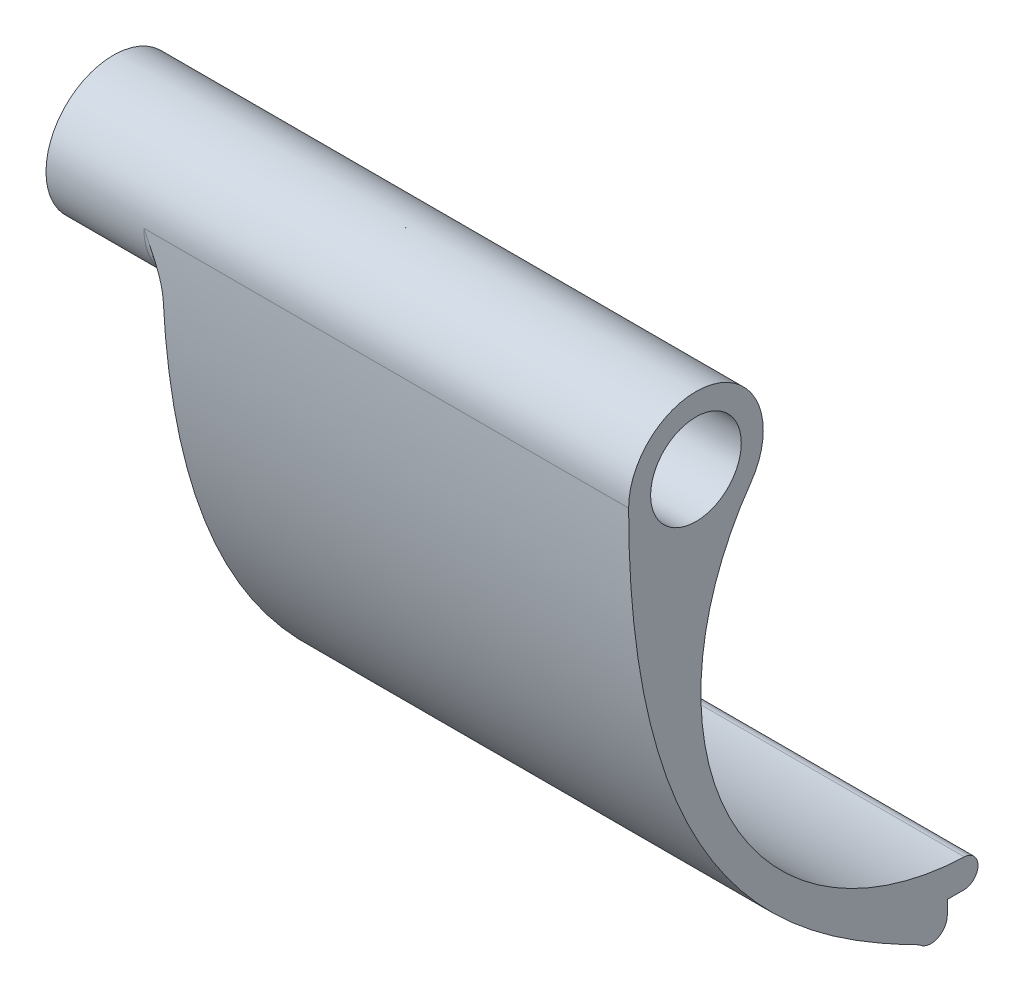
ISO-10303-21;
HEADER;
FILE_DESCRIPTION(('STEP AP214'),'2;1');
FILE_NAME('part.step','',(''),(''),'','','');
FILE_SCHEMA(('AUTOMOTIVE_DESIGN { 1 0 10303 214 1 1 1 1 }'));
ENDSEC;
DATA;
#1=APPLICATION_CONTEXT('core data for automotive mechanical design processes');
#2=APPLICATION_PROTOCOL_DEFINITION('international standard','automotive_design',2000,#1);
#3=PRODUCT_CONTEXT('',#1,'mechanical');
#4=PRODUCT('Part','Part','',(#3));
#5=PRODUCT_RELATED_PRODUCT_CATEGORY('part','',(#4));
#6=PRODUCT_DEFINITION_FORMATION('','',#4);
#7=PRODUCT_DEFINITION_CONTEXT('part definition',#1,'design');
#8=PRODUCT_DEFINITION('design','',#6,#7);
#9=PRODUCT_DEFINITION_SHAPE('','',#8);
#10=(LENGTH_UNIT() NAMED_UNIT(*) SI_UNIT(.MILLI.,.METRE.));
#11=(NAMED_UNIT(*) PLANE_ANGLE_UNIT() SI_UNIT($,.RADIAN.));
#12=(NAMED_UNIT(*) SI_UNIT($,.STERADIAN.) SOLID_ANGLE_UNIT());
#13=UNCERTAINTY_MEASURE_WITH_UNIT(LENGTH_MEASURE(1.E-05),#10,'distance_accuracy_value','');
#14=(GEOMETRIC_REPRESENTATION_CONTEXT(3) GLOBAL_UNCERTAINTY_ASSIGNED_CONTEXT((#13)) GLOBAL_UNIT_ASSIGNED_CONTEXT((#10,
#11,#12)) REPRESENTATION_CONTEXT('',''));
#15=CARTESIAN_POINT('',(0.,0.,0.));
#16=DIRECTION('',(0.,0.,1.));
#17=DIRECTION('',(1.,0.,0.));
#18=AXIS2_PLACEMENT_3D('',#15,#16,#17);
#19=CARTESIAN_POINT('',(66.04,-52.2496729145659,-4.41520027118186));
#20=DIRECTION('',(-1.,0.,0.));
#21=DIRECTION('',(0.,0.,1.));
#22=AXIS2_PLACEMENT_3D('',#19,#20,#21);
#23=PLANE('',#22);
#24=CARTESIAN_POINT('',(66.04,0.,9.525));
#25=CARTESIAN_POINT('',(66.04,-49.5650692046343,9.52500000000007));
#26=CARTESIAN_POINT('',(66.04,-65.0783953227281,-13.9379384526841));
#27=CARTESIAN_POINT('',(66.04,-74.0669897344399,-31.6077868114028));
#28=B_SPLINE_CURVE_WITH_KNOTS('',3,(#24,#25,#26,#27),.UNSPECIFIED.,.F.,.F.,(4,4),(0.,
0.946238125414386),.UNSPECIFIED.);
#29=CARTESIAN_POINT('',(66.04,0.,9.525));
#30=VERTEX_POINT('',#29);
#31=CARTESIAN_POINT('',(66.04,-74.0669897344399,-31.6077868114029));
#32=VERTEX_POINT('',#31);
#33=EDGE_CURVE('E113',#30,#32,#28,.T.);
#34=ORIENTED_EDGE('',*,*,#33,.T.);
#35=CARTESIAN_POINT('',(66.04,-72.4361186255965,-33.247405917965));
#36=DIRECTION('',(1.,0.,0.));
#37=DIRECTION('',(0.,0.,-1.));
#38=AXIS2_PLACEMENT_3D('',#35,#36,#37);
#39=CIRCLE('',#38,2.31259408203504);
#40=CARTESIAN_POINT('',(66.04,-72.4361186255965,-35.56));
#41=VERTEX_POINT('',#40);
#42=EDGE_CURVE('E103',#32,#41,#39,.T.);
#43=ORIENTED_EDGE('',*,*,#42,.T.);
#44=DIRECTION('',(0.,1.,0.));
#45=VECTOR('',#44,1.);
#46=CARTESIAN_POINT('',(66.04,-70.4890000000009,-35.56));
#47=LINE('',#46,#45);
#48=CARTESIAN_POINT('',(66.04,-70.4890000000009,-35.56));
#49=VERTEX_POINT('',#48);
#50=EDGE_CURVE('E112',#41,#49,#47,.T.);
#51=ORIENTED_EDGE('',*,*,#50,.T.);
#52=DIRECTION('',(0.,0.,-1.));
#53=VECTOR('',#52,1.);
#54=CARTESIAN_POINT('',(66.04,-70.4890000000009,-37.8977944152424));
#55=LINE('',#54,#53);
#56=CARTESIAN_POINT('',(66.04,-70.4890000000009,-37.8977944152424));
#57=VERTEX_POINT('',#56);
#58=EDGE_CURVE('E165',#49,#57,#55,.T.);
#59=ORIENTED_EDGE('',*,*,#58,.T.);
#60=CARTESIAN_POINT('',(66.04,-68.4811487911356,-37.8977944152424));
#61=DIRECTION('',(1.,0.,0.));
#62=DIRECTION('',(0.,0.,1.));
#63=AXIS2_PLACEMENT_3D('',#60,#61,#62);
#64=CIRCLE('',#63,2.00785120886528);
#65=CARTESIAN_POINT('',(66.04,-66.474655704137,-37.9716318635245));
#66=VERTEX_POINT('',#65);
#67=EDGE_CURVE('E167',#57,#66,#64,.T.);
#68=ORIENTED_EDGE('',*,*,#67,.T.);
#69=CARTESIAN_POINT('',(66.04,-27.8062883190183,-39.3945989275299));
#70=DIRECTION('',(-1.,0.,0.));
#71=DIRECTION('',(0.,0.,-1.));
#72=AXIS2_PLACEMENT_3D('',#69,#70,#71);
#73=CIRCLE('',#72,38.6945405903179);
#74=CARTESIAN_POINT('',(66.04,-5.49268808860924,-7.78177374132981));
#75=VERTEX_POINT('',#74);
#76=EDGE_CURVE('E169',#66,#75,#73,.T.);
#77=ORIENTED_EDGE('',*,*,#76,.T.);
#78=CARTESIAN_POINT('',(66.04,0.,0.));
#79=DIRECTION('',(1.,0.,0.));
#80=DIRECTION('',(0.,0.,1.));
#81=AXIS2_PLACEMENT_3D('',#78,#79,#80);
#82=CIRCLE('',#81,9.525);
#83=EDGE_CURVE('E118',#75,#30,#82,.T.);
#84=ORIENTED_EDGE('',*,*,#83,.T.);
#85=EDGE_LOOP('',(#34,#43,#51,#59,#68,#77,#84));
#86=FACE_BOUND('',#85,.T.);
#87=CARTESIAN_POINT('',(66.04,0.,0.));
#88=DIRECTION('',(1.,0.,0.));
#89=DIRECTION('',(0.,0.,-1.));
#90=AXIS2_PLACEMENT_3D('',#87,#88,#89);
#91=CIRCLE('',#90,6.4135);
#92=CARTESIAN_POINT('',(66.04,0.,-6.4135));
#93=VERTEX_POINT('',#92);
#94=EDGE_CURVE('E145',#93,#93,#91,.T.);
#95=ORIENTED_EDGE('',*,*,#94,.F.);
#96=EDGE_LOOP('',(#95));
#97=FACE_BOUND('',#96,.T.);
#98=ADVANCED_FACE('F33',(#86,#97),#23,.F.);
#99=CARTESIAN_POINT('',(0.,-52.2496729145659,-4.41520027118186));
#100=DIRECTION('',(-1.,0.,0.));
#101=DIRECTION('',(0.,0.,1.));
#102=AXIS2_PLACEMENT_3D('',#99,#100,#101);
#103=PLANE('',#102);
#104=CARTESIAN_POINT('',(0.,0.,9.525));
#105=CARTESIAN_POINT('',(0.,-49.5650692046343,9.52500000000007));
#106=CARTESIAN_POINT('',(0.,-65.0783953227281,-13.9379384526841));
#107=CARTESIAN_POINT('',(0.,-74.0669897344399,-31.6077868114028));
#108=B_SPLINE_CURVE_WITH_KNOTS('',3,(#104,#105,#106,#107),.UNSPECIFIED.,.F.,.F.,(4,4),(0.,
0.946238125414386),.UNSPECIFIED.);
#109=CARTESIAN_POINT('',(0.,-7.65092428072875,9.3288575211842));
#110=VERTEX_POINT('',#109);
#111=CARTESIAN_POINT('',(0.,-74.0669897344399,-31.6077868114029));
#112=VERTEX_POINT('',#111);
#113=EDGE_CURVE('E123',#110,#112,#108,.T.);
#114=ORIENTED_EDGE('',*,*,#113,.F.);
#115=CARTESIAN_POINT('',(0.,0.,0.));
#116=DIRECTION('',(-1.,0.,0.));
#117=DIRECTION('',(0.,0.,1.));
#118=AXIS2_PLACEMENT_3D('',#115,#116,#117);
#119=CIRCLE('',#118,12.065);
#120=CARTESIAN_POINT('',(0.,-11.2202851417415,-4.43502269870355));
#121=VERTEX_POINT('',#120);
#122=EDGE_CURVE('E59',#110,#121,#119,.F.);
#123=ORIENTED_EDGE('',*,*,#122,.T.);
#124=CARTESIAN_POINT('',(0.,-27.8062883190183,-39.3945989275299));
#125=DIRECTION('',(-1.,0.,0.));
#126=DIRECTION('',(0.,0.,-1.));
#127=AXIS2_PLACEMENT_3D('',#124,#125,#126);
#128=CIRCLE('',#127,38.6945405903179);
#129=CARTESIAN_POINT('',(0.,-66.474655704137,-37.9716318635245));
#130=VERTEX_POINT('',#129);
#131=EDGE_CURVE('E120',#130,#121,#128,.T.);
#132=ORIENTED_EDGE('',*,*,#131,.F.);
#133=CARTESIAN_POINT('',(0.,-68.4811487911356,-37.8977944152424));
#134=DIRECTION('',(1.,0.,0.));
#135=DIRECTION('',(0.,0.,1.));
#136=AXIS2_PLACEMENT_3D('',#133,#134,#135);
#137=CIRCLE('',#136,2.00785120886528);
#138=CARTESIAN_POINT('',(0.,-70.4890000000009,-37.8977944152424));
#139=VERTEX_POINT('',#138);
#140=EDGE_CURVE('E177',#139,#130,#137,.T.);
#141=ORIENTED_EDGE('',*,*,#140,.F.);
#142=DIRECTION('',(0.,0.,-1.));
#143=VECTOR('',#142,1.);
#144=CARTESIAN_POINT('',(0.,-70.4890000000009,-37.8977944152424));
#145=LINE('',#144,#143);
#146=CARTESIAN_POINT('',(0.,-70.4890000000009,-35.56));
#147=VERTEX_POINT('',#146);
#148=EDGE_CURVE('E175',#147,#139,#145,.T.);
#149=ORIENTED_EDGE('',*,*,#148,.F.);
#150=DIRECTION('',(0.,1.,0.));
#151=VECTOR('',#150,1.);
#152=CARTESIAN_POINT('',(0.,-70.4890000000009,-35.56));
#153=LINE('',#152,#151);
#154=CARTESIAN_POINT('',(0.,-72.4361186255965,-35.56));
#155=VERTEX_POINT('',#154);
#156=EDGE_CURVE('E173',#155,#147,#153,.T.);
#157=ORIENTED_EDGE('',*,*,#156,.F.);
#158=CARTESIAN_POINT('',(0.,-72.4361186255965,-33.247405917965));
#159=DIRECTION('',(1.,0.,0.));
#160=DIRECTION('',(0.,0.,-1.));
#161=AXIS2_PLACEMENT_3D('',#158,#159,#160);
#162=CIRCLE('',#161,2.31259408203504);
#163=EDGE_CURVE('E144',#112,#155,#162,.T.);
#164=ORIENTED_EDGE('',*,*,#163,.F.);
#165=EDGE_LOOP('',(#114,#123,#132,#141,#149,#157,#164));
#166=FACE_BOUND('',#165,.T.);
#167=ADVANCED_FACE('F153',(#166),#103,.T.);
#168=DIRECTION('',(-1.,0.,0.));
#169=VECTOR('',#168,1.);
#170=SURFACE_OF_LINEAR_EXTRUSION('',#28,#169);
#171=DIRECTION('',(-1.,0.,0.));
#172=VECTOR('',#171,1.);
#173=CARTESIAN_POINT('',(66.04,0.,9.525));
#174=LINE('',#173,#172);
#175=CARTESIAN_POINT('',(-2.54,0.,9.525));
#176=VERTEX_POINT('',#175);
#177=EDGE_CURVE('E137',#30,#176,#174,.T.);
#178=ORIENTED_EDGE('',*,*,#177,.T.);
#179=CARTESIAN_POINT('',(0.,-7.65092428072876,9.3288575211842));
#180=CARTESIAN_POINT('',(-3.67137742443882E-05,-7.46956825615845,9.3384051629864));
#181=CARTESIAN_POINT('',(-0.0068366632049906,-7.28830536543436,9.34757758555238));
#182=CARTESIAN_POINT('',(-0.0323922824100331,-6.927167958474,9.36513417199838));
#183=CARTESIAN_POINT('',(-0.0511087091187828,-6.74729083921552,9.37352081996479));
#184=CARTESIAN_POINT('',(-0.0989276173249353,-6.3890751355162,9.38952425878425));
#185=CARTESIAN_POINT('',(-0.128021719327641,-6.21073542832939,9.39714166441617));
#186=CARTESIAN_POINT('',(-0.194875964816023,-5.85807298974564,9.41153316401279));
#187=CARTESIAN_POINT('',(-0.232518667603411,-5.6837281682459,9.41831692445825));
#188=CARTESIAN_POINT('',(-0.315590279102238,-5.33675198319984,9.43117931729091));
#189=CARTESIAN_POINT('',(-0.361025076235058,-5.16412202070115,9.43725741054307));
#190=CARTESIAN_POINT('',(-0.458679212125702,-4.82073393382911,9.44872910316047));
#191=CARTESIAN_POINT('',(-0.510900413394934,-4.64997633732413,9.45412251381004));
#192=CARTESIAN_POINT('',(-0.691392288193954,-4.09424521512783,9.47069632199648));
#193=CARTESIAN_POINT('',(-0.831875335173097,-3.71318638562277,9.48050719654218));
#194=CARTESIAN_POINT('',(-1.1339071195417,-2.95963305211854,9.4970511419831));
#195=CARTESIAN_POINT('',(-1.29545884427241,-2.58713977146123,9.50378377580146));
#196=CARTESIAN_POINT('',(-1.63262402728517,-1.84689241256717,9.51446582408605));
#197=CARTESIAN_POINT('',(-1.80828888098986,-1.47916189555357,9.51840450022618));
#198=CARTESIAN_POINT('',(-2.16626988181893,-0.746942348703278,9.52365033607386));
#199=CARTESIAN_POINT('',(-2.34858668882966,-0.382453644945906,9.52495723397744));
#200=CARTESIAN_POINT('',(-2.53399083654299,-0.0120064869276534,9.5249996547445));
#201=CARTESIAN_POINT('',(-2.53699541426876,-0.00600324094862723,9.52499999890273));
#202=CARTESIAN_POINT('',(-2.54,0.,9.525));
#203=B_SPLINE_CURVE_WITH_KNOTS('',3,(#179,#180,#181,#182,#183,#184,#185,#186,#187,#188,#189,
#190,#191,#192,#193,#194,#195,#196,#197,#198,#199,#200,#201,#202),.UNSPECIFIED.,.F.,.F.,(4,2,2,
2,2,2,2,2,2,2,2,4),(0.,0.544533976283044,1.08728391643874,1.62959659941398,2.16486697307682,
2.70054364301574,3.23636763976689,4.45403778923178,5.67188078102058,6.89437944859708,
8.11699972186345,8.1371391866897),.UNSPECIFIED.);
#204=EDGE_CURVE('E46',#176,#110,#203,.F.);
#205=ORIENTED_EDGE('',*,*,#204,.T.);
#206=ORIENTED_EDGE('',*,*,#113,.T.);
#207=DIRECTION('',(-1.,0.,0.));
#208=VECTOR('',#207,1.);
#209=CARTESIAN_POINT('',(66.04,-74.0669897344399,-31.6077868114029));
#210=LINE('',#209,#208);
#211=EDGE_CURVE('E107',#32,#112,#210,.T.);
#212=ORIENTED_EDGE('',*,*,#211,.F.);
#213=ORIENTED_EDGE('',*,*,#33,.F.);
#214=EDGE_LOOP('',(#178,#205,#206,#212,#213));
#215=FACE_BOUND('',#214,.T.);
#216=ADVANCED_FACE('F122',(#215),#170,.F.);
#217=CARTESIAN_POINT('',(66.04,-72.4361186255965,-33.247405917965));
#218=DIRECTION('',(-1.,0.,0.));
#219=DIRECTION('',(0.,0.,1.));
#220=AXIS2_PLACEMENT_3D('',#217,#218,#219);
#221=CYLINDRICAL_SURFACE('',#220,2.31259408203504);
#222=ORIENTED_EDGE('',*,*,#163,.T.);
#223=DIRECTION('',(-1.,0.,0.));
#224=VECTOR('',#223,1.);
#225=CARTESIAN_POINT('',(66.04,-72.4361186255965,-35.56));
#226=LINE('',#225,#224);
#227=EDGE_CURVE('E109',#41,#155,#226,.T.);
#228=ORIENTED_EDGE('',*,*,#227,.F.);
#229=ORIENTED_EDGE('',*,*,#42,.F.);
#230=ORIENTED_EDGE('',*,*,#211,.T.);
#231=EDGE_LOOP('',(#222,#228,#229,#230));
#232=FACE_BOUND('',#231,.T.);
#233=ADVANCED_FACE('F105',(#232),#221,.T.);
#234=CARTESIAN_POINT('',(66.04,-70.4890000000009,-35.56));
#235=DIRECTION('',(0.,0.,1.));
#236=DIRECTION('',(1.,0.,0.));
#237=AXIS2_PLACEMENT_3D('',#234,#235,#236);
#238=PLANE('',#237);
#239=ORIENTED_EDGE('',*,*,#156,.T.);
#240=DIRECTION('',(-1.,0.,0.));
#241=VECTOR('',#240,1.);
#242=CARTESIAN_POINT('',(66.04,-70.4890000000009,-35.56));
#243=LINE('',#242,#241);
#244=EDGE_CURVE('E129',#49,#147,#243,.T.);
#245=ORIENTED_EDGE('',*,*,#244,.F.);
#246=ORIENTED_EDGE('',*,*,#50,.F.);
#247=ORIENTED_EDGE('',*,*,#227,.T.);
#248=EDGE_LOOP('',(#239,#245,#246,#247));
#249=FACE_BOUND('',#248,.T.);
#250=ADVANCED_FACE('F204',(#249),#238,.F.);
#251=CARTESIAN_POINT('',(66.04,-70.4890000000009,-37.8977944152424));
#252=DIRECTION('',(0.,1.,0.));
#253=DIRECTION('',(0.,0.,1.));
#254=AXIS2_PLACEMENT_3D('',#251,#252,#253);
#255=PLANE('',#254);
#256=ORIENTED_EDGE('',*,*,#148,.T.);
#257=DIRECTION('',(-1.,0.,0.));
#258=VECTOR('',#257,1.);
#259=CARTESIAN_POINT('',(66.04,-70.4890000000009,-37.8977944152424));
#260=LINE('',#259,#258);
#261=EDGE_CURVE('E182',#57,#139,#260,.T.);
#262=ORIENTED_EDGE('',*,*,#261,.F.);
#263=ORIENTED_EDGE('',*,*,#58,.F.);
#264=ORIENTED_EDGE('',*,*,#244,.T.);
#265=EDGE_LOOP('',(#256,#262,#263,#264));
#266=FACE_BOUND('',#265,.T.);
#267=ADVANCED_FACE('F190',(#266),#255,.F.);
#268=CARTESIAN_POINT('',(66.04,-68.4811487911356,-37.8977944152424));
#269=DIRECTION('',(-1.,0.,0.));
#270=DIRECTION('',(0.,0.,1.));
#271=AXIS2_PLACEMENT_3D('',#268,#269,#270);
#272=CYLINDRICAL_SURFACE('',#271,2.00785120886528);
#273=ORIENTED_EDGE('',*,*,#140,.T.);
#274=DIRECTION('',(-1.,0.,0.));
#275=VECTOR('',#274,1.);
#276=CARTESIAN_POINT('',(66.04,-66.474655704137,-37.9716318635245));
#277=LINE('',#276,#275);
#278=EDGE_CURVE('E179',#66,#130,#277,.T.);
#279=ORIENTED_EDGE('',*,*,#278,.F.);
#280=ORIENTED_EDGE('',*,*,#67,.F.);
#281=ORIENTED_EDGE('',*,*,#261,.T.);
#282=EDGE_LOOP('',(#273,#279,#280,#281));
#283=FACE_BOUND('',#282,.T.);
#284=ADVANCED_FACE('F197',(#283),#272,.T.);
#285=CARTESIAN_POINT('',(66.04,-27.8062883190183,-39.3945989275299));
#286=DIRECTION('',(-1.,0.,0.));
#287=DIRECTION('',(0.,0.,1.));
#288=AXIS2_PLACEMENT_3D('',#285,#286,#287);
#289=CYLINDRICAL_SURFACE('',#288,38.6945405903179);
#290=ORIENTED_EDGE('',*,*,#131,.T.);
#291=CARTESIAN_POINT('',(0.,-11.2202851417415,-4.43502269870355));
#292=CARTESIAN_POINT('',(-5.11864777043864E-05,-11.056806273389,-4.5125716730527));
#293=CARTESIAN_POINT('',(-0.00900270136259433,-10.8940819092378,-4.59118871608675));
#294=CARTESIAN_POINT('',(-0.0423030237824772,-10.571354057374,-4.74987978294838));
#295=CARTESIAN_POINT('',(-0.066617393832991,-10.4113453039535,-4.82995016007784));
#296=CARTESIAN_POINT('',(-0.127835873748703,-10.0967100295228,-4.99010623478544));
#297=CARTESIAN_POINT('',(-0.164561504783471,-9.94203969777102,-5.07017645387601));
#298=CARTESIAN_POINT('',(-0.248791871943821,-9.63602848474103,-5.23118243434323));
#299=CARTESIAN_POINT('',(-0.296303214965065,-9.48468970683275,-5.31211869714612));
#300=CARTESIAN_POINT('',(-0.409297017768542,-9.16001892188421,-5.48849578837866));
#301=CARTESIAN_POINT('',(-0.476462669726448,-8.98734129179699,-5.58405469983231));
#302=CARTESIAN_POINT('',(-0.620950903299191,-8.64668257582106,-5.77592533789878));
#303=CARTESIAN_POINT('',(-0.698276950321911,-8.47870311615415,-5.87223731076983));
#304=CARTESIAN_POINT('',(-0.86117123806376,-8.14703465801866,-6.06566077051067));
#305=CARTESIAN_POINT('',(-0.946747417250091,-7.9833499886462,-6.16277294352249));
#306=CARTESIAN_POINT('',(-1.12438057831267,-7.66000606561038,-6.35779513922315));
#307=CARTESIAN_POINT('',(-1.21643857938245,-7.50034745038306,-6.45570528523446));
#308=CARTESIAN_POINT('',(-1.50133950092519,-7.02451870548181,-6.75220133002424));
#309=CARTESIAN_POINT('',(-1.70173590584428,-6.71378435449465,-6.95221443409699));
#310=CARTESIAN_POINT('',(-2.11182951901496,-6.10273217566414,-7.35778425339951));
#311=CARTESIAN_POINT('',(-2.32152170608681,-5.80240887675402,-7.56333795287523));
#312=CARTESIAN_POINT('',(-2.53417825780186,-5.50093945298075,-7.77595081295433));
#313=CARTESIAN_POINT('',(-2.53708912995861,-5.49681348664156,-7.77886187583044));
#314=CARTESIAN_POINT('',(-2.54,-5.49268808860924,-7.7817737413298));
#315=B_SPLINE_CURVE_WITH_KNOTS('',3,(#291,#292,#293,#294,#295,#296,#297,#298,#299,#300,#301,
#302,#303,#304,#305,#306,#307,#308,#309,#310,#311,#312,#313,#314),.UNSPECIFIED.,.F.,.F.,(4,2,2,
2,2,2,2,2,2,2,2,4),(0.,0.54227687667618,1.08334247339008,1.61693687704804,2.15085902551159,
2.77590076722315,3.40115624810631,4.0270194859202,4.65298135440291,5.91358661352881,
7.1735190530545,7.19100446253694),.UNSPECIFIED.);
#316=CARTESIAN_POINT('',(-2.54,-5.49268808860924,-7.78177374132981));
#317=VERTEX_POINT('',#316);
#318=EDGE_CURVE('E11',#121,#317,#315,.T.);
#319=ORIENTED_EDGE('',*,*,#318,.T.);
#320=DIRECTION('',(-1.,0.,0.));
#321=VECTOR('',#320,1.);
#322=CARTESIAN_POINT('',(66.04,-5.49268808860924,-7.78177374132981));
#323=LINE('',#322,#321);
#324=EDGE_CURVE('E183',#75,#317,#323,.T.);
#325=ORIENTED_EDGE('',*,*,#324,.F.);
#326=ORIENTED_EDGE('',*,*,#76,.F.);
#327=ORIENTED_EDGE('',*,*,#278,.T.);
#328=EDGE_LOOP('',(#290,#319,#325,#326,#327));
#329=FACE_BOUND('',#328,.T.);
#330=ADVANCED_FACE('F201',(#329),#289,.F.);
#331=CARTESIAN_POINT('',(66.04,0.,0.));
#332=DIRECTION('',(-1.,0.,0.));
#333=DIRECTION('',(0.,0.,1.));
#334=AXIS2_PLACEMENT_3D('',#331,#332,#333);
#335=CYLINDRICAL_SURFACE('',#334,9.525);
#336=CARTESIAN_POINT('',(-2.54,0.,0.));
#337=DIRECTION('',(-1.,0.,0.));
#338=DIRECTION('',(0.,0.,1.));
#339=AXIS2_PLACEMENT_3D('',#336,#337,#338);
#340=CIRCLE('',#339,9.525);
#341=EDGE_CURVE('E125',#317,#176,#340,.T.);
#342=ORIENTED_EDGE('',*,*,#341,.T.);
#343=ORIENTED_EDGE('',*,*,#177,.F.);
#344=ORIENTED_EDGE('',*,*,#83,.F.);
#345=ORIENTED_EDGE('',*,*,#324,.T.);
#346=EDGE_LOOP('',(#342,#343,#344,#345));
#347=FACE_BOUND('',#346,.T.);
#348=CARTESIAN_POINT('',(-16.383,0.,0.));
#349=DIRECTION('',(-1.,0.,0.));
#350=DIRECTION('',(0.,0.,1.));
#351=AXIS2_PLACEMENT_3D('',#348,#349,#350);
#352=CIRCLE('',#351,9.525);
#353=CARTESIAN_POINT('',(-16.383,0.,9.525));
#354=VERTEX_POINT('',#353);
#355=EDGE_CURVE('E319',#354,#354,#352,.T.);
#356=ORIENTED_EDGE('',*,*,#355,.F.);
#357=EDGE_LOOP('',(#356));
#358=FACE_BOUND('',#357,.T.);
#359=ADVANCED_FACE('F221',(#347,#358),#335,.T.);
#360=CARTESIAN_POINT('',(66.04,0.,0.));
#361=DIRECTION('',(-1.,0.,0.));
#362=DIRECTION('',(0.,0.,1.));
#363=AXIS2_PLACEMENT_3D('',#360,#361,#362);
#364=CYLINDRICAL_SURFACE('',#363,6.4135);
#365=ORIENTED_EDGE('',*,*,#94,.T.);
#366=EDGE_LOOP('',(#365));
#367=FACE_BOUND('',#366,.T.);
#368=CARTESIAN_POINT('',(-16.383,0.,0.));
#369=DIRECTION('',(-1.,0.,0.));
#370=DIRECTION('',(0.,0.,1.));
#371=AXIS2_PLACEMENT_3D('',#368,#369,#370);
#372=CIRCLE('',#371,6.4135);
#373=CARTESIAN_POINT('',(-16.383,0.,6.4135));
#374=VERTEX_POINT('',#373);
#375=EDGE_CURVE('E320',#374,#374,#372,.T.);
#376=ORIENTED_EDGE('',*,*,#375,.T.);
#377=EDGE_LOOP('',(#376));
#378=FACE_BOUND('',#377,.T.);
#379=ADVANCED_FACE('F218',(#367,#378),#364,.F.);
#380=CARTESIAN_POINT('',(-16.383,0.,0.));
#381=DIRECTION('',(-1.,0.,0.));
#382=DIRECTION('',(0.,0.,1.));
#383=AXIS2_PLACEMENT_3D('',#380,#381,#382);
#384=PLANE('',#383);
#385=ORIENTED_EDGE('',*,*,#355,.T.);
#386=EDGE_LOOP('',(#385));
#387=FACE_BOUND('',#386,.T.);
#388=ORIENTED_EDGE('',*,*,#375,.F.);
#389=EDGE_LOOP('',(#388));
#390=FACE_BOUND('',#389,.T.);
#391=ADVANCED_FACE('F248',(#387,#390),#384,.T.);
#392=CARTESIAN_POINT('',(-2.54,0.,0.));
#393=DIRECTION('',(-1.,0.,0.));
#394=DIRECTION('',(0.,0.,1.));
#395=AXIS2_PLACEMENT_3D('',#392,#393,#394);
#396=TOROIDAL_SURFACE('',#395,12.065,2.54);
#397=ORIENTED_EDGE('',*,*,#318,.F.);
#398=ORIENTED_EDGE('',*,*,#122,.F.);
#399=ORIENTED_EDGE('',*,*,#204,.F.);
#400=ORIENTED_EDGE('',*,*,#341,.F.);
#401=EDGE_LOOP('',(#397,#398,#399,#400));
#402=FACE_BOUND('',#401,.T.);
#403=ADVANCED_FACE('F35',(#402),#396,.F.);
#404=CLOSED_SHELL('',(#98,#167,#216,#233,#250,#267,#284,#330,#359,#379,#391,#403));
#405=MANIFOLD_SOLID_BREP('B2',#404);
#406=ADVANCED_BREP_SHAPE_REPRESENTATION('',(#18,#405),#14);
#407=SHAPE_DEFINITION_REPRESENTATION(#9,#406);
ENDSEC;
END-ISO-10303-21;
